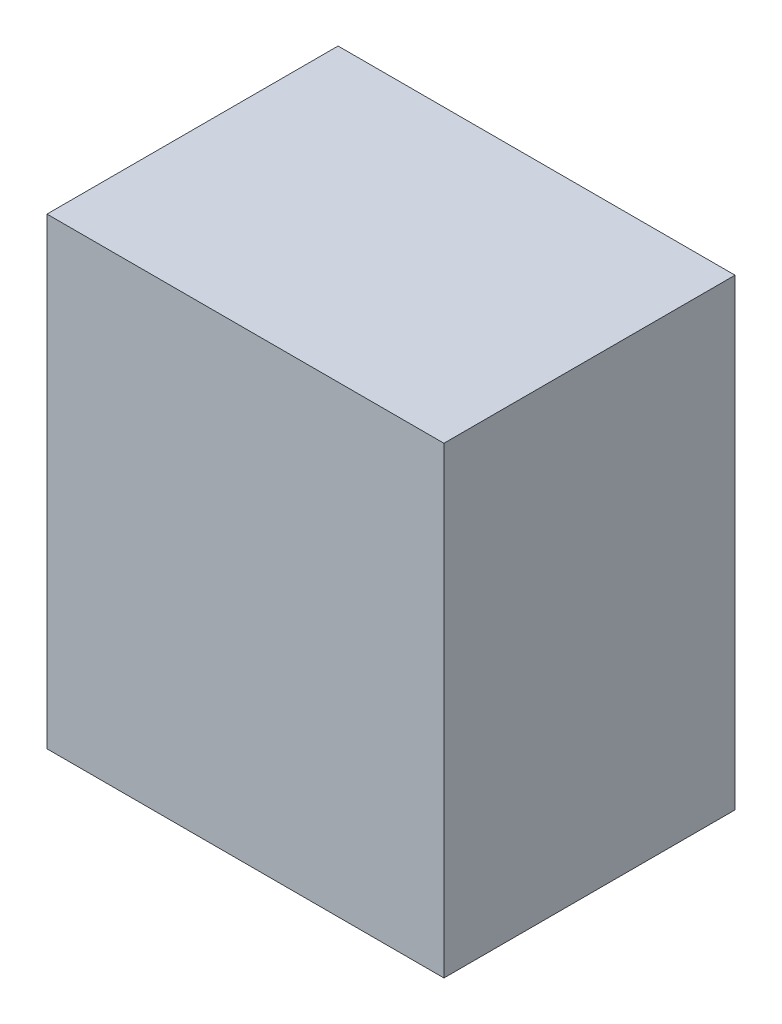
ISO-10303-21;
HEADER;
FILE_DESCRIPTION(('STEP AP214'),'2;1');
FILE_NAME('part.step','',(''),(''),'','','');
FILE_SCHEMA(('AUTOMOTIVE_DESIGN { 1 0 10303 214 1 1 1 1 }'));
ENDSEC;
DATA;
#1=APPLICATION_CONTEXT('core data for automotive mechanical design processes');
#2=APPLICATION_PROTOCOL_DEFINITION('international standard','automotive_design',2000,#1);
#3=PRODUCT_CONTEXT('',#1,'mechanical');
#4=PRODUCT('Part','Part','',(#3));
#5=PRODUCT_RELATED_PRODUCT_CATEGORY('part','',(#4));
#6=PRODUCT_DEFINITION_FORMATION('','',#4);
#7=PRODUCT_DEFINITION_CONTEXT('part definition',#1,'design');
#8=PRODUCT_DEFINITION('design','',#6,#7);
#9=PRODUCT_DEFINITION_SHAPE('','',#8);
#10=(LENGTH_UNIT() NAMED_UNIT(*) SI_UNIT(.MILLI.,.METRE.));
#11=(NAMED_UNIT(*) PLANE_ANGLE_UNIT() SI_UNIT($,.RADIAN.));
#12=(NAMED_UNIT(*) SI_UNIT($,.STERADIAN.) SOLID_ANGLE_UNIT());
#13=UNCERTAINTY_MEASURE_WITH_UNIT(LENGTH_MEASURE(1.E-05),#10,'distance_accuracy_value','');
#14=(GEOMETRIC_REPRESENTATION_CONTEXT(3) GLOBAL_UNCERTAINTY_ASSIGNED_CONTEXT((#13)) GLOBAL_UNIT_ASSIGNED_CONTEXT((#10,
#11,#12)) REPRESENTATION_CONTEXT('',''));
#15=CARTESIAN_POINT('',(0.,0.,0.));
#16=DIRECTION('',(0.,0.,1.));
#17=DIRECTION('',(1.,0.,0.));
#18=AXIS2_PLACEMENT_3D('',#15,#16,#17);
#19=CARTESIAN_POINT('',(-4.50000116,5.24999966,6.6));
#20=DIRECTION('',(0.,0.,-1.));
#21=DIRECTION('',(-1.,0.,0.));
#22=AXIS2_PLACEMENT_3D('',#19,#20,#21);
#23=PLANE('',#22);
#24=DIRECTION('',(1.,0.,0.));
#25=VECTOR('',#24,1.);
#26=CARTESIAN_POINT('',(-4.50000116,-5.24999966,6.6));
#27=LINE('',#26,#25);
#28=CARTESIAN_POINT('',(-4.50000116,-5.24999966,6.6));
#29=VERTEX_POINT('',#28);
#30=CARTESIAN_POINT('',(4.50000116,-5.24999966,6.6));
#31=VERTEX_POINT('',#30);
#32=EDGE_CURVE('E55',#29,#31,#27,.T.);
#33=ORIENTED_EDGE('',*,*,#32,.T.);
#34=DIRECTION('',(0.,1.,0.));
#35=VECTOR('',#34,1.);
#36=CARTESIAN_POINT('',(4.50000116,-5.24999966,6.6));
#37=LINE('',#36,#35);
#38=CARTESIAN_POINT('',(4.50000116,5.24999966,6.6));
#39=VERTEX_POINT('',#38);
#40=EDGE_CURVE('E57',#31,#39,#37,.T.);
#41=ORIENTED_EDGE('',*,*,#40,.T.);
#42=DIRECTION('',(1.,0.,0.));
#43=VECTOR('',#42,1.);
#44=CARTESIAN_POINT('',(4.50000116,5.24999966,6.6));
#45=LINE('',#44,#43);
#46=CARTESIAN_POINT('',(-4.50000116,5.24999966,6.6));
#47=VERTEX_POINT('',#46);
#48=EDGE_CURVE('E20',#39,#47,#45,.F.);
#49=ORIENTED_EDGE('',*,*,#48,.T.);
#50=DIRECTION('',(0.,1.,0.));
#51=VECTOR('',#50,1.);
#52=CARTESIAN_POINT('',(-4.50000116,5.24999966,6.6));
#53=LINE('',#52,#51);
#54=EDGE_CURVE('E80',#47,#29,#53,.F.);
#55=ORIENTED_EDGE('',*,*,#54,.T.);
#56=EDGE_LOOP('',(#33,#41,#49,#55));
#57=FACE_BOUND('',#56,.T.);
#58=ADVANCED_FACE('F17',(#57),#23,.F.);
#59=CARTESIAN_POINT('',(4.50000116,5.24999966,0.));
#60=DIRECTION('',(0.,-1.,0.));
#61=DIRECTION('',(0.,0.,-1.));
#62=AXIS2_PLACEMENT_3D('',#59,#60,#61);
#63=PLANE('',#62);
#64=DIRECTION('',(0.,0.,-1.));
#65=VECTOR('',#64,1.);
#66=CARTESIAN_POINT('',(-4.50000116,5.24999966,0.));
#67=LINE('',#66,#65);
#68=CARTESIAN_POINT('',(-4.50000116,5.24999966,0.));
#69=VERTEX_POINT('',#68);
#70=EDGE_CURVE('E68',#69,#47,#67,.F.);
#71=ORIENTED_EDGE('',*,*,#70,.T.);
#72=ORIENTED_EDGE('',*,*,#48,.F.);
#73=DIRECTION('',(0.,0.,1.));
#74=VECTOR('',#73,1.);
#75=CARTESIAN_POINT('',(4.50000116,5.24999966,0.));
#76=LINE('',#75,#74);
#77=CARTESIAN_POINT('',(4.50000116,5.24999966,0.));
#78=VERTEX_POINT('',#77);
#79=EDGE_CURVE('E63',#39,#78,#76,.F.);
#80=ORIENTED_EDGE('',*,*,#79,.T.);
#81=DIRECTION('',(-1.,0.,0.));
#82=VECTOR('',#81,1.);
#83=CARTESIAN_POINT('',(-4.50000116,5.24999966,0.));
#84=LINE('',#83,#82);
#85=EDGE_CURVE('E83',#69,#78,#84,.F.);
#86=ORIENTED_EDGE('',*,*,#85,.F.);
#87=EDGE_LOOP('',(#71,#72,#80,#86));
#88=FACE_BOUND('',#87,.T.);
#89=ADVANCED_FACE('F65',(#88),#63,.F.);
#90=CARTESIAN_POINT('',(4.50000116,-5.24999966,0.));
#91=DIRECTION('',(-1.,0.,0.));
#92=DIRECTION('',(0.,0.,1.));
#93=AXIS2_PLACEMENT_3D('',#90,#91,#92);
#94=PLANE('',#93);
#95=ORIENTED_EDGE('',*,*,#79,.F.);
#96=ORIENTED_EDGE('',*,*,#40,.F.);
#97=DIRECTION('',(0.,0.,1.));
#98=VECTOR('',#97,1.);
#99=CARTESIAN_POINT('',(4.50000116,-5.24999966,0.));
#100=LINE('',#99,#98);
#101=CARTESIAN_POINT('',(4.50000116,-5.24999966,0.));
#102=VERTEX_POINT('',#101);
#103=EDGE_CURVE('E75',#31,#102,#100,.F.);
#104=ORIENTED_EDGE('',*,*,#103,.T.);
#105=DIRECTION('',(0.,1.,0.));
#106=VECTOR('',#105,1.);
#107=CARTESIAN_POINT('',(4.50000116,5.24999966,0.));
#108=LINE('',#107,#106);
#109=EDGE_CURVE('E72',#78,#102,#108,.F.);
#110=ORIENTED_EDGE('',*,*,#109,.F.);
#111=EDGE_LOOP('',(#95,#96,#104,#110));
#112=FACE_BOUND('',#111,.T.);
#113=ADVANCED_FACE('F70',(#112),#94,.F.);
#114=CARTESIAN_POINT('',(-4.50000116,-5.24999966,0.));
#115=DIRECTION('',(0.,1.,0.));
#116=DIRECTION('',(0.,0.,1.));
#117=AXIS2_PLACEMENT_3D('',#114,#115,#116);
#118=PLANE('',#117);
#119=ORIENTED_EDGE('',*,*,#103,.F.);
#120=ORIENTED_EDGE('',*,*,#32,.F.);
#121=DIRECTION('',(0.,0.,-1.));
#122=VECTOR('',#121,1.);
#123=CARTESIAN_POINT('',(-4.50000116,-5.24999966,0.));
#124=LINE('',#123,#122);
#125=CARTESIAN_POINT('',(-4.50000116,-5.24999966,0.));
#126=VERTEX_POINT('',#125);
#127=EDGE_CURVE('E35',#29,#126,#124,.T.);
#128=ORIENTED_EDGE('',*,*,#127,.T.);
#129=DIRECTION('',(-1.,0.,0.));
#130=VECTOR('',#129,1.);
#131=CARTESIAN_POINT('',(-4.50000116,-5.24999966,0.));
#132=LINE('',#131,#130);
#133=EDGE_CURVE('E26',#102,#126,#132,.T.);
#134=ORIENTED_EDGE('',*,*,#133,.F.);
#135=EDGE_LOOP('',(#119,#120,#128,#134));
#136=FACE_BOUND('',#135,.T.);
#137=ADVANCED_FACE('F89',(#136),#118,.F.);
#138=CARTESIAN_POINT('',(-4.50000116,5.24999966,0.));
#139=DIRECTION('',(1.,0.,0.));
#140=DIRECTION('',(0.,0.,-1.));
#141=AXIS2_PLACEMENT_3D('',#138,#139,#140);
#142=PLANE('',#141);
#143=ORIENTED_EDGE('',*,*,#127,.F.);
#144=ORIENTED_EDGE('',*,*,#54,.F.);
#145=ORIENTED_EDGE('',*,*,#70,.F.);
#146=DIRECTION('',(0.,1.,0.));
#147=VECTOR('',#146,1.);
#148=CARTESIAN_POINT('',(-4.50000116,5.24999966,0.));
#149=LINE('',#148,#147);
#150=EDGE_CURVE('E11',#126,#69,#149,.T.);
#151=ORIENTED_EDGE('',*,*,#150,.F.);
#152=EDGE_LOOP('',(#143,#144,#145,#151));
#153=FACE_BOUND('',#152,.T.);
#154=ADVANCED_FACE('F91',(#153),#142,.F.);
#155=CARTESIAN_POINT('',(-4.50000116,5.24999966,0.));
#156=DIRECTION('',(0.,0.,-1.));
#157=DIRECTION('',(-1.,0.,0.));
#158=AXIS2_PLACEMENT_3D('',#155,#156,#157);
#159=PLANE('',#158);
#160=ORIENTED_EDGE('',*,*,#133,.T.);
#161=ORIENTED_EDGE('',*,*,#150,.T.);
#162=ORIENTED_EDGE('',*,*,#85,.T.);
#163=ORIENTED_EDGE('',*,*,#109,.T.);
#164=EDGE_LOOP('',(#160,#161,#162,#163));
#165=FACE_BOUND('',#164,.T.);
#166=ADVANCED_FACE('F88',(#165),#159,.T.);
#167=CLOSED_SHELL('',(#58,#89,#113,#137,#154,#166));
#168=MANIFOLD_SOLID_BREP('B1',#167);
#169=ADVANCED_BREP_SHAPE_REPRESENTATION('',(#18,#168),#14);
#170=SHAPE_DEFINITION_REPRESENTATION(#9,#169);
ENDSEC;
END-ISO-10303-21;
